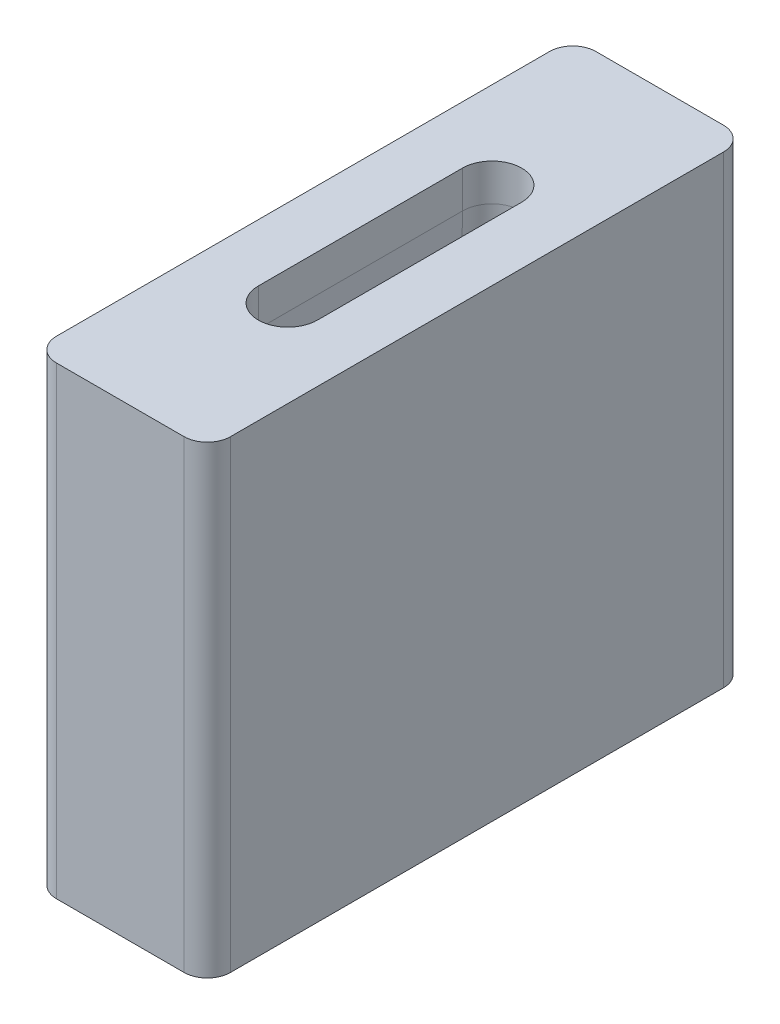
ISO-10303-21;
HEADER;
FILE_DESCRIPTION(('STEP AP214'),'2;1');
FILE_NAME('part.step','',(''),(''),'','','');
FILE_SCHEMA(('AUTOMOTIVE_DESIGN { 1 0 10303 214 1 1 1 1 }'));
ENDSEC;
DATA;
#1=APPLICATION_CONTEXT('core data for automotive mechanical design processes');
#2=APPLICATION_PROTOCOL_DEFINITION('international standard','automotive_design',2000,#1);
#3=PRODUCT_CONTEXT('',#1,'mechanical');
#4=PRODUCT('Part','Part','',(#3));
#5=PRODUCT_RELATED_PRODUCT_CATEGORY('part','',(#4));
#6=PRODUCT_DEFINITION_FORMATION('','',#4);
#7=PRODUCT_DEFINITION_CONTEXT('part definition',#1,'design');
#8=PRODUCT_DEFINITION('design','',#6,#7);
#9=PRODUCT_DEFINITION_SHAPE('','',#8);
#10=(LENGTH_UNIT() NAMED_UNIT(*) SI_UNIT(.MILLI.,.METRE.));
#11=(NAMED_UNIT(*) PLANE_ANGLE_UNIT() SI_UNIT($,.RADIAN.));
#12=(NAMED_UNIT(*) SI_UNIT($,.STERADIAN.) SOLID_ANGLE_UNIT());
#13=UNCERTAINTY_MEASURE_WITH_UNIT(LENGTH_MEASURE(1.E-05),#10,'distance_accuracy_value','');
#14=(GEOMETRIC_REPRESENTATION_CONTEXT(3) GLOBAL_UNCERTAINTY_ASSIGNED_CONTEXT((#13)) GLOBAL_UNIT_ASSIGNED_CONTEXT((#10,
#11,#12)) REPRESENTATION_CONTEXT('',''));
#15=CARTESIAN_POINT('',(0.,0.,0.));
#16=DIRECTION('',(0.,0.,1.));
#17=DIRECTION('',(1.,0.,0.));
#18=AXIS2_PLACEMENT_3D('',#15,#16,#17);
#19=CARTESIAN_POINT('',(0.,-40.001,8.8));
#20=DIRECTION('',(0.,1.,0.));
#21=DIRECTION('',(0.,0.,1.));
#22=AXIS2_PLACEMENT_3D('',#19,#20,#21);
#23=CYLINDRICAL_SURFACE('',#22,2.55);
#24=CARTESIAN_POINT('',(0.,-3.2,8.8));
#25=DIRECTION('',(0.,1.,0.));
#26=DIRECTION('',(-1.,0.,0.));
#27=AXIS2_PLACEMENT_3D('',#24,#25,#26);
#28=CIRCLE('',#27,2.55);
#29=CARTESIAN_POINT('',(-2.55,-3.2,8.8));
#30=VERTEX_POINT('',#29);
#31=CARTESIAN_POINT('',(2.55,-3.20000000000065,8.8));
#32=VERTEX_POINT('',#31);
#33=EDGE_CURVE('E75',#30,#32,#28,.T.);
#34=ORIENTED_EDGE('',*,*,#33,.F.);
#35=DIRECTION('',(0.,1.,0.));
#36=VECTOR('',#35,1.);
#37=CARTESIAN_POINT('',(-2.55,-40.001,8.8));
#38=LINE('',#37,#36);
#39=CARTESIAN_POINT('',(-2.55,0.,8.8));
#40=VERTEX_POINT('',#39);
#41=EDGE_CURVE('E238',#30,#40,#38,.T.);
#42=ORIENTED_EDGE('',*,*,#41,.T.);
#43=CARTESIAN_POINT('',(0.,0.,8.8));
#44=DIRECTION('',(0.,1.,0.));
#45=DIRECTION('',(0.,0.,1.));
#46=AXIS2_PLACEMENT_3D('',#43,#44,#45);
#47=CIRCLE('',#46,2.55);
#48=CARTESIAN_POINT('',(2.55,0.,8.8));
#49=VERTEX_POINT('',#48);
#50=EDGE_CURVE('E224',#40,#49,#47,.T.);
#51=ORIENTED_EDGE('',*,*,#50,.T.);
#52=DIRECTION('',(0.,1.,0.));
#53=VECTOR('',#52,1.);
#54=CARTESIAN_POINT('',(2.55,-40.001,8.8));
#55=LINE('',#54,#53);
#56=EDGE_CURVE('E237',#32,#49,#55,.T.);
#57=ORIENTED_EDGE('',*,*,#56,.F.);
#58=EDGE_LOOP('',(#34,#42,#51,#57));
#59=FACE_BOUND('',#58,.T.);
#60=ADVANCED_FACE('F51',(#59),#23,.F.);
#61=CARTESIAN_POINT('',(-2.55,-40.001,8.8));
#62=DIRECTION('',(-1.,0.,0.));
#63=DIRECTION('',(0.,0.,1.));
#64=AXIS2_PLACEMENT_3D('',#61,#62,#63);
#65=PLANE('',#64);
#66=DIRECTION('',(0.,0.,1.));
#67=VECTOR('',#66,1.);
#68=CARTESIAN_POINT('',(-2.55000000000001,-3.2,-8.8));
#69=LINE('',#68,#67);
#70=CARTESIAN_POINT('',(-2.55000000000001,-3.2,-8.8));
#71=VERTEX_POINT('',#70);
#72=EDGE_CURVE('E212',#71,#30,#69,.T.);
#73=ORIENTED_EDGE('',*,*,#72,.F.);
#74=DIRECTION('',(0.,1.,0.));
#75=VECTOR('',#74,1.);
#76=CARTESIAN_POINT('',(-2.55,-40.001,-8.8));
#77=LINE('',#76,#75);
#78=CARTESIAN_POINT('',(-2.55,0.,-8.8));
#79=VERTEX_POINT('',#78);
#80=EDGE_CURVE('E241',#71,#79,#77,.T.);
#81=ORIENTED_EDGE('',*,*,#80,.T.);
#82=DIRECTION('',(0.,0.,1.));
#83=VECTOR('',#82,1.);
#84=CARTESIAN_POINT('',(-2.55,0.,8.8));
#85=LINE('',#84,#83);
#86=EDGE_CURVE('E234',#79,#40,#85,.T.);
#87=ORIENTED_EDGE('',*,*,#86,.T.);
#88=ORIENTED_EDGE('',*,*,#41,.F.);
#89=EDGE_LOOP('',(#73,#81,#87,#88));
#90=FACE_BOUND('',#89,.T.);
#91=ADVANCED_FACE('F346',(#90),#65,.F.);
#92=CARTESIAN_POINT('',(0.,-40.001,-8.8));
#93=DIRECTION('',(0.,1.,0.));
#94=DIRECTION('',(0.,0.,1.));
#95=AXIS2_PLACEMENT_3D('',#92,#93,#94);
#96=CYLINDRICAL_SURFACE('',#95,2.55);
#97=CARTESIAN_POINT('',(0.,-3.2,-8.8));
#98=DIRECTION('',(0.,1.,0.));
#99=DIRECTION('',(1.,0.,0.));
#100=AXIS2_PLACEMENT_3D('',#97,#98,#99);
#101=CIRCLE('',#100,2.55);
#102=CARTESIAN_POINT('',(2.55,-3.2,-8.8));
#103=VERTEX_POINT('',#102);
#104=EDGE_CURVE('E204',#103,#71,#101,.T.);
#105=ORIENTED_EDGE('',*,*,#104,.F.);
#106=DIRECTION('',(0.,1.,0.));
#107=VECTOR('',#106,1.);
#108=CARTESIAN_POINT('',(2.55,-40.001,-8.8));
#109=LINE('',#108,#107);
#110=CARTESIAN_POINT('',(2.55,0.,-8.8));
#111=VERTEX_POINT('',#110);
#112=EDGE_CURVE('E243',#103,#111,#109,.T.);
#113=ORIENTED_EDGE('',*,*,#112,.T.);
#114=CARTESIAN_POINT('',(0.,0.,-8.8));
#115=DIRECTION('',(0.,1.,0.));
#116=DIRECTION('',(0.,0.,1.));
#117=AXIS2_PLACEMENT_3D('',#114,#115,#116);
#118=CIRCLE('',#117,2.55);
#119=EDGE_CURVE('E231',#111,#79,#118,.T.);
#120=ORIENTED_EDGE('',*,*,#119,.T.);
#121=ORIENTED_EDGE('',*,*,#80,.F.);
#122=EDGE_LOOP('',(#105,#113,#120,#121));
#123=FACE_BOUND('',#122,.T.);
#124=ADVANCED_FACE('F353',(#123),#96,.F.);
#125=CARTESIAN_POINT('',(2.55,-40.001,8.8));
#126=DIRECTION('',(1.,0.,0.));
#127=DIRECTION('',(0.,0.,-1.));
#128=AXIS2_PLACEMENT_3D('',#125,#126,#127);
#129=PLANE('',#128);
#130=DIRECTION('',(0.,0.,-1.));
#131=VECTOR('',#130,1.);
#132=CARTESIAN_POINT('',(2.55,-3.2,0.));
#133=LINE('',#132,#131);
#134=CARTESIAN_POINT('',(2.55,-3.2,0.));
#135=VERTEX_POINT('',#134);
#136=EDGE_CURVE('E196',#135,#103,#133,.T.);
#137=ORIENTED_EDGE('',*,*,#136,.F.);
#138=DIRECTION('',(0.,0.,-1.));
#139=VECTOR('',#138,1.);
#140=CARTESIAN_POINT('',(2.55,-3.2,8.8));
#141=LINE('',#140,#139);
#142=EDGE_CURVE('E221',#32,#135,#141,.T.);
#143=ORIENTED_EDGE('',*,*,#142,.F.);
#144=ORIENTED_EDGE('',*,*,#56,.T.);
#145=DIRECTION('',(0.,0.,-1.));
#146=VECTOR('',#145,1.);
#147=CARTESIAN_POINT('',(2.55,0.,8.8));
#148=LINE('',#147,#146);
#149=EDGE_CURVE('E228',#49,#111,#148,.T.);
#150=ORIENTED_EDGE('',*,*,#149,.T.);
#151=ORIENTED_EDGE('',*,*,#112,.F.);
#152=EDGE_LOOP('',(#137,#143,#144,#150,#151));
#153=FACE_BOUND('',#152,.T.);
#154=ADVANCED_FACE('F358',(#153),#129,.F.);
#155=CARTESIAN_POINT('',(-5.5,-40.,21.25));
#156=DIRECTION('',(0.,1.,0.));
#157=DIRECTION('',(0.,0.,1.));
#158=AXIS2_PLACEMENT_3D('',#155,#156,#157);
#159=CYLINDRICAL_SURFACE('',#158,2.);
#160=CARTESIAN_POINT('',(-5.5,0.,21.25));
#161=DIRECTION('',(0.,1.,0.));
#162=DIRECTION('',(0.,0.,-1.));
#163=AXIS2_PLACEMENT_3D('',#160,#161,#162);
#164=CIRCLE('',#163,2.);
#165=CARTESIAN_POINT('',(-7.5,0.,21.25));
#166=VERTEX_POINT('',#165);
#167=CARTESIAN_POINT('',(-5.5,0.,23.25));
#168=VERTEX_POINT('',#167);
#169=EDGE_CURVE('E240',#166,#168,#164,.T.);
#170=ORIENTED_EDGE('',*,*,#169,.F.);
#171=DIRECTION('',(0.,1.,0.));
#172=VECTOR('',#171,1.);
#173=CARTESIAN_POINT('',(-7.5,-40.,21.25));
#174=LINE('',#173,#172);
#175=CARTESIAN_POINT('',(-7.5,-40.,21.25));
#176=VERTEX_POINT('',#175);
#177=EDGE_CURVE('E11',#176,#166,#174,.T.);
#178=ORIENTED_EDGE('',*,*,#177,.F.);
#179=CARTESIAN_POINT('',(-5.5,-40.,21.25));
#180=DIRECTION('',(0.,1.,0.));
#181=DIRECTION('',(0.,0.,-1.));
#182=AXIS2_PLACEMENT_3D('',#179,#180,#181);
#183=CIRCLE('',#182,2.);
#184=CARTESIAN_POINT('',(-5.5,-40.,23.25));
#185=VERTEX_POINT('',#184);
#186=EDGE_CURVE('E246',#176,#185,#183,.T.);
#187=ORIENTED_EDGE('',*,*,#186,.T.);
#188=DIRECTION('',(0.,1.,0.));
#189=VECTOR('',#188,1.);
#190=CARTESIAN_POINT('',(-5.5,-40.,23.25));
#191=LINE('',#190,#189);
#192=EDGE_CURVE('E55',#185,#168,#191,.T.);
#193=ORIENTED_EDGE('',*,*,#192,.T.);
#194=EDGE_LOOP('',(#170,#178,#187,#193));
#195=FACE_BOUND('',#194,.T.);
#196=ADVANCED_FACE('F53',(#195),#159,.T.);
#197=CARTESIAN_POINT('',(-7.5,-40.,21.25));
#198=DIRECTION('',(-1.,0.,0.));
#199=DIRECTION('',(0.,0.,1.));
#200=AXIS2_PLACEMENT_3D('',#197,#198,#199);
#201=PLANE('',#200);
#202=DIRECTION('',(0.,0.,1.));
#203=VECTOR('',#202,1.);
#204=CARTESIAN_POINT('',(-7.5,0.,21.25));
#205=LINE('',#204,#203);
#206=CARTESIAN_POINT('',(-7.5,0.,-21.25));
#207=VERTEX_POINT('',#206);
#208=EDGE_CURVE('E250',#207,#166,#205,.T.);
#209=ORIENTED_EDGE('',*,*,#208,.F.);
#210=DIRECTION('',(0.,1.,0.));
#211=VECTOR('',#210,1.);
#212=CARTESIAN_POINT('',(-7.5,-40.,-21.25));
#213=LINE('',#212,#211);
#214=CARTESIAN_POINT('',(-7.5,-40.,-21.25));
#215=VERTEX_POINT('',#214);
#216=EDGE_CURVE('E60',#215,#207,#213,.T.);
#217=ORIENTED_EDGE('',*,*,#216,.F.);
#218=DIRECTION('',(0.,0.,1.));
#219=VECTOR('',#218,1.);
#220=CARTESIAN_POINT('',(-7.5,-40.,21.25));
#221=LINE('',#220,#219);
#222=EDGE_CURVE('E268',#215,#176,#221,.T.);
#223=ORIENTED_EDGE('',*,*,#222,.T.);
#224=ORIENTED_EDGE('',*,*,#177,.T.);
#225=EDGE_LOOP('',(#209,#217,#223,#224));
#226=FACE_BOUND('',#225,.T.);
#227=ADVANCED_FACE('F315',(#226),#201,.T.);
#228=CARTESIAN_POINT('',(-5.5,-40.,-21.25));
#229=DIRECTION('',(0.,1.,0.));
#230=DIRECTION('',(0.,0.,1.));
#231=AXIS2_PLACEMENT_3D('',#228,#229,#230);
#232=CYLINDRICAL_SURFACE('',#231,2.);
#233=CARTESIAN_POINT('',(-5.5,0.,-21.25));
#234=DIRECTION('',(0.,1.,0.));
#235=DIRECTION('',(0.,0.,-1.));
#236=AXIS2_PLACEMENT_3D('',#233,#234,#235);
#237=CIRCLE('',#236,2.);
#238=CARTESIAN_POINT('',(-5.5,0.,-23.25));
#239=VERTEX_POINT('',#238);
#240=EDGE_CURVE('E288',#239,#207,#237,.T.);
#241=ORIENTED_EDGE('',*,*,#240,.F.);
#242=DIRECTION('',(0.,1.,0.));
#243=VECTOR('',#242,1.);
#244=CARTESIAN_POINT('',(-5.5,-40.,-23.25));
#245=LINE('',#244,#243);
#246=CARTESIAN_POINT('',(-5.5,-40.,-23.25));
#247=VERTEX_POINT('',#246);
#248=EDGE_CURVE('E294',#247,#239,#245,.T.);
#249=ORIENTED_EDGE('',*,*,#248,.F.);
#250=CARTESIAN_POINT('',(-5.5,-40.,-21.25));
#251=DIRECTION('',(0.,1.,0.));
#252=DIRECTION('',(0.,0.,-1.));
#253=AXIS2_PLACEMENT_3D('',#250,#251,#252);
#254=CIRCLE('',#253,2.);
#255=EDGE_CURVE('E265',#247,#215,#254,.T.);
#256=ORIENTED_EDGE('',*,*,#255,.T.);
#257=ORIENTED_EDGE('',*,*,#216,.T.);
#258=EDGE_LOOP('',(#241,#249,#256,#257));
#259=FACE_BOUND('',#258,.T.);
#260=ADVANCED_FACE('F336',(#259),#232,.T.);
#261=CARTESIAN_POINT('',(-5.5,-40.,-23.25));
#262=DIRECTION('',(0.,0.,-1.));
#263=DIRECTION('',(-1.,0.,0.));
#264=AXIS2_PLACEMENT_3D('',#261,#262,#263);
#265=PLANE('',#264);
#266=DIRECTION('',(-1.,0.,0.));
#267=VECTOR('',#266,1.);
#268=CARTESIAN_POINT('',(-5.5,0.,-23.25));
#269=LINE('',#268,#267);
#270=CARTESIAN_POINT('',(5.5,0.,-23.25));
#271=VERTEX_POINT('',#270);
#272=EDGE_CURVE('E285',#271,#239,#269,.T.);
#273=ORIENTED_EDGE('',*,*,#272,.F.);
#274=DIRECTION('',(0.,1.,0.));
#275=VECTOR('',#274,1.);
#276=CARTESIAN_POINT('',(5.5,-40.,-23.25));
#277=LINE('',#276,#275);
#278=CARTESIAN_POINT('',(5.5,-40.,-23.25));
#279=VERTEX_POINT('',#278);
#280=EDGE_CURVE('E296',#279,#271,#277,.T.);
#281=ORIENTED_EDGE('',*,*,#280,.F.);
#282=DIRECTION('',(-1.,0.,0.));
#283=VECTOR('',#282,1.);
#284=CARTESIAN_POINT('',(-5.5,-40.,-23.25));
#285=LINE('',#284,#283);
#286=EDGE_CURVE('E262',#279,#247,#285,.T.);
#287=ORIENTED_EDGE('',*,*,#286,.T.);
#288=ORIENTED_EDGE('',*,*,#248,.T.);
#289=EDGE_LOOP('',(#273,#281,#287,#288));
#290=FACE_BOUND('',#289,.T.);
#291=ADVANCED_FACE('F334',(#290),#265,.T.);
#292=CARTESIAN_POINT('',(5.5,-40.,-21.25));
#293=DIRECTION('',(0.,1.,0.));
#294=DIRECTION('',(0.,0.,1.));
#295=AXIS2_PLACEMENT_3D('',#292,#293,#294);
#296=CYLINDRICAL_SURFACE('',#295,2.);
#297=CARTESIAN_POINT('',(5.5,0.,-21.25));
#298=DIRECTION('',(0.,1.,0.));
#299=DIRECTION('',(0.,0.,-1.));
#300=AXIS2_PLACEMENT_3D('',#297,#298,#299);
#301=CIRCLE('',#300,2.);
#302=CARTESIAN_POINT('',(7.5,0.,-21.25));
#303=VERTEX_POINT('',#302);
#304=EDGE_CURVE('E282',#303,#271,#301,.T.);
#305=ORIENTED_EDGE('',*,*,#304,.F.);
#306=DIRECTION('',(0.,1.,0.));
#307=VECTOR('',#306,1.);
#308=CARTESIAN_POINT('',(7.5,-40.,-21.25));
#309=LINE('',#308,#307);
#310=CARTESIAN_POINT('',(7.5,-40.,-21.25));
#311=VERTEX_POINT('',#310);
#312=EDGE_CURVE('E298',#311,#303,#309,.T.);
#313=ORIENTED_EDGE('',*,*,#312,.F.);
#314=CARTESIAN_POINT('',(5.5,-40.,-21.25));
#315=DIRECTION('',(0.,1.,0.));
#316=DIRECTION('',(0.,0.,-1.));
#317=AXIS2_PLACEMENT_3D('',#314,#315,#316);
#318=CIRCLE('',#317,2.);
#319=EDGE_CURVE('E259',#311,#279,#318,.T.);
#320=ORIENTED_EDGE('',*,*,#319,.T.);
#321=ORIENTED_EDGE('',*,*,#280,.T.);
#322=EDGE_LOOP('',(#305,#313,#320,#321));
#323=FACE_BOUND('',#322,.T.);
#324=ADVANCED_FACE('F330',(#323),#296,.T.);
#325=CARTESIAN_POINT('',(7.5,-40.,21.25));
#326=DIRECTION('',(1.,0.,0.));
#327=DIRECTION('',(0.,0.,-1.));
#328=AXIS2_PLACEMENT_3D('',#325,#326,#327);
#329=PLANE('',#328);
#330=DIRECTION('',(0.,0.,-1.));
#331=VECTOR('',#330,1.);
#332=CARTESIAN_POINT('',(7.5,0.,21.25));
#333=LINE('',#332,#331);
#334=CARTESIAN_POINT('',(7.5,0.,21.25));
#335=VERTEX_POINT('',#334);
#336=EDGE_CURVE('E279',#335,#303,#333,.T.);
#337=ORIENTED_EDGE('',*,*,#336,.F.);
#338=DIRECTION('',(0.,1.,0.));
#339=VECTOR('',#338,1.);
#340=CARTESIAN_POINT('',(7.5,-40.,21.25));
#341=LINE('',#340,#339);
#342=CARTESIAN_POINT('',(7.5,-40.,21.25));
#343=VERTEX_POINT('',#342);
#344=EDGE_CURVE('E300',#343,#335,#341,.T.);
#345=ORIENTED_EDGE('',*,*,#344,.F.);
#346=DIRECTION('',(0.,0.,-1.));
#347=VECTOR('',#346,1.);
#348=CARTESIAN_POINT('',(7.5,-40.,21.25));
#349=LINE('',#348,#347);
#350=EDGE_CURVE('E256',#343,#311,#349,.T.);
#351=ORIENTED_EDGE('',*,*,#350,.T.);
#352=ORIENTED_EDGE('',*,*,#312,.T.);
#353=EDGE_LOOP('',(#337,#345,#351,#352));
#354=FACE_BOUND('',#353,.T.);
#355=ADVANCED_FACE('F328',(#354),#329,.T.);
#356=CARTESIAN_POINT('',(5.5,-40.,21.25));
#357=DIRECTION('',(0.,1.,0.));
#358=DIRECTION('',(0.,0.,1.));
#359=AXIS2_PLACEMENT_3D('',#356,#357,#358);
#360=CYLINDRICAL_SURFACE('',#359,2.);
#361=CARTESIAN_POINT('',(5.5,0.,21.25));
#362=DIRECTION('',(0.,1.,0.));
#363=DIRECTION('',(0.,0.,1.));
#364=AXIS2_PLACEMENT_3D('',#361,#362,#363);
#365=CIRCLE('',#364,2.);
#366=CARTESIAN_POINT('',(5.5,0.,23.25));
#367=VERTEX_POINT('',#366);
#368=EDGE_CURVE('E276',#367,#335,#365,.T.);
#369=ORIENTED_EDGE('',*,*,#368,.F.);
#370=DIRECTION('',(0.,1.,0.));
#371=VECTOR('',#370,1.);
#372=CARTESIAN_POINT('',(5.5,-40.,23.25));
#373=LINE('',#372,#371);
#374=CARTESIAN_POINT('',(5.5,-40.,23.25));
#375=VERTEX_POINT('',#374);
#376=EDGE_CURVE('E301',#375,#367,#373,.T.);
#377=ORIENTED_EDGE('',*,*,#376,.F.);
#378=CARTESIAN_POINT('',(5.5,-40.,21.25));
#379=DIRECTION('',(0.,1.,0.));
#380=DIRECTION('',(0.,0.,1.));
#381=AXIS2_PLACEMENT_3D('',#378,#379,#380);
#382=CIRCLE('',#381,2.);
#383=EDGE_CURVE('E253',#375,#343,#382,.T.);
#384=ORIENTED_EDGE('',*,*,#383,.T.);
#385=ORIENTED_EDGE('',*,*,#344,.T.);
#386=EDGE_LOOP('',(#369,#377,#384,#385));
#387=FACE_BOUND('',#386,.T.);
#388=ADVANCED_FACE('F324',(#387),#360,.T.);
#389=CARTESIAN_POINT('',(-5.5,-40.,23.25));
#390=DIRECTION('',(0.,0.,1.));
#391=DIRECTION('',(1.,0.,0.));
#392=AXIS2_PLACEMENT_3D('',#389,#390,#391);
#393=PLANE('',#392);
#394=DIRECTION('',(1.,0.,0.));
#395=VECTOR('',#394,1.);
#396=CARTESIAN_POINT('',(-5.5,0.,23.25));
#397=LINE('',#396,#395);
#398=EDGE_CURVE('E273',#168,#367,#397,.T.);
#399=ORIENTED_EDGE('',*,*,#398,.F.);
#400=ORIENTED_EDGE('',*,*,#192,.F.);
#401=DIRECTION('',(1.,0.,0.));
#402=VECTOR('',#401,1.);
#403=CARTESIAN_POINT('',(-5.5,-40.,23.25));
#404=LINE('',#403,#402);
#405=EDGE_CURVE('E249',#185,#375,#404,.T.);
#406=ORIENTED_EDGE('',*,*,#405,.T.);
#407=ORIENTED_EDGE('',*,*,#376,.T.);
#408=EDGE_LOOP('',(#399,#400,#406,#407));
#409=FACE_BOUND('',#408,.T.);
#410=ADVANCED_FACE('F309',(#409),#393,.T.);
#411=CARTESIAN_POINT('',(-5.5,-40.,21.25));
#412=DIRECTION('',(0.,-1.,0.));
#413=DIRECTION('',(0.,0.,-1.));
#414=AXIS2_PLACEMENT_3D('',#411,#412,#413);
#415=PLANE('',#414);
#416=CARTESIAN_POINT('',(0.,-40.,-19.25));
#417=DIRECTION('',(0.,-1.,0.));
#418=DIRECTION('',(0.,0.,-1.));
#419=AXIS2_PLACEMENT_3D('',#416,#417,#418);
#420=CIRCLE('',#419,3.025);
#421=CARTESIAN_POINT('',(0.,-40.,-22.275));
#422=VERTEX_POINT('',#421);
#423=EDGE_CURVE('E181',#422,#422,#420,.T.);
#424=ORIENTED_EDGE('',*,*,#423,.F.);
#425=EDGE_LOOP('',(#424));
#426=FACE_BOUND('',#425,.T.);
#427=CARTESIAN_POINT('',(0.,-40.,19.25));
#428=DIRECTION('',(0.,-1.,0.));
#429=DIRECTION('',(0.,0.,-1.));
#430=AXIS2_PLACEMENT_3D('',#427,#428,#429);
#431=CIRCLE('',#430,3.025);
#432=CARTESIAN_POINT('',(0.,-40.,16.225));
#433=VERTEX_POINT('',#432);
#434=EDGE_CURVE('E174',#433,#433,#431,.T.);
#435=ORIENTED_EDGE('',*,*,#434,.F.);
#436=EDGE_LOOP('',(#435));
#437=FACE_BOUND('',#436,.T.);
#438=CARTESIAN_POINT('',(0.,-40.,8.8));
#439=DIRECTION('',(0.,1.,0.));
#440=DIRECTION('',(-1.,0.,0.));
#441=AXIS2_PLACEMENT_3D('',#438,#439,#440);
#442=CIRCLE('',#441,3.19234638935816);
#443=CARTESIAN_POINT('',(-3.19234638935816,-40.,8.8));
#444=VERTEX_POINT('',#443);
#445=CARTESIAN_POINT('',(3.19234638935816,-40.,8.8));
#446=VERTEX_POINT('',#445);
#447=EDGE_CURVE('E211',#444,#446,#442,.T.);
#448=ORIENTED_EDGE('',*,*,#447,.T.);
#449=DIRECTION('',(0.,0.,-1.));
#450=VECTOR('',#449,1.);
#451=CARTESIAN_POINT('',(3.19234638935816,-40.,8.8));
#452=LINE('',#451,#450);
#453=CARTESIAN_POINT('',(3.19234638935816,-40.,0.));
#454=VERTEX_POINT('',#453);
#455=EDGE_CURVE('E68',#446,#454,#452,.T.);
#456=ORIENTED_EDGE('',*,*,#455,.T.);
#457=DIRECTION('',(0.,0.,-1.));
#458=VECTOR('',#457,1.);
#459=CARTESIAN_POINT('',(3.19234638935816,-40.,0.));
#460=LINE('',#459,#458);
#461=CARTESIAN_POINT('',(3.19234638935816,-40.,-8.8));
#462=VERTEX_POINT('',#461);
#463=EDGE_CURVE('E192',#454,#462,#460,.T.);
#464=ORIENTED_EDGE('',*,*,#463,.T.);
#465=CARTESIAN_POINT('',(0.,-40.,-8.8));
#466=DIRECTION('',(0.,1.,0.));
#467=DIRECTION('',(1.,0.,0.));
#468=AXIS2_PLACEMENT_3D('',#465,#466,#467);
#469=CIRCLE('',#468,3.19234638935816);
#470=CARTESIAN_POINT('',(-3.19234638935816,-40.,-8.8));
#471=VERTEX_POINT('',#470);
#472=EDGE_CURVE('E198',#462,#471,#469,.T.);
#473=ORIENTED_EDGE('',*,*,#472,.T.);
#474=DIRECTION('',(0.,0.,1.));
#475=VECTOR('',#474,1.);
#476=CARTESIAN_POINT('',(-3.19234638935816,-40.,-8.8));
#477=LINE('',#476,#475);
#478=EDGE_CURVE('E206',#471,#444,#477,.T.);
#479=ORIENTED_EDGE('',*,*,#478,.T.);
#480=EDGE_LOOP('',(#448,#456,#464,#473,#479));
#481=FACE_BOUND('',#480,.T.);
#482=ORIENTED_EDGE('',*,*,#186,.F.);
#483=ORIENTED_EDGE('',*,*,#222,.F.);
#484=ORIENTED_EDGE('',*,*,#255,.F.);
#485=ORIENTED_EDGE('',*,*,#286,.F.);
#486=ORIENTED_EDGE('',*,*,#319,.F.);
#487=ORIENTED_EDGE('',*,*,#350,.F.);
#488=ORIENTED_EDGE('',*,*,#383,.F.);
#489=ORIENTED_EDGE('',*,*,#405,.F.);
#490=EDGE_LOOP('',(#482,#483,#484,#485,#486,#487,#488,#489));
#491=FACE_BOUND('',#490,.T.);
#492=ADVANCED_FACE('F318',(#426,#437,#481,#491),#415,.T.);
#493=CARTESIAN_POINT('',(-5.5,0.,21.25));
#494=DIRECTION('',(0.,-1.,0.));
#495=DIRECTION('',(0.,0.,-1.));
#496=AXIS2_PLACEMENT_3D('',#493,#494,#495);
#497=PLANE('',#496);
#498=ORIENTED_EDGE('',*,*,#149,.F.);
#499=ORIENTED_EDGE('',*,*,#50,.F.);
#500=ORIENTED_EDGE('',*,*,#86,.F.);
#501=ORIENTED_EDGE('',*,*,#119,.F.);
#502=EDGE_LOOP('',(#498,#499,#500,#501));
#503=FACE_BOUND('',#502,.T.);
#504=ORIENTED_EDGE('',*,*,#169,.T.);
#505=ORIENTED_EDGE('',*,*,#398,.T.);
#506=ORIENTED_EDGE('',*,*,#368,.T.);
#507=ORIENTED_EDGE('',*,*,#336,.T.);
#508=ORIENTED_EDGE('',*,*,#304,.T.);
#509=ORIENTED_EDGE('',*,*,#272,.T.);
#510=ORIENTED_EDGE('',*,*,#240,.T.);
#511=ORIENTED_EDGE('',*,*,#208,.T.);
#512=EDGE_LOOP('',(#504,#505,#506,#507,#508,#509,#510,#511));
#513=FACE_BOUND('',#512,.T.);
#514=ADVANCED_FACE('F311',(#503,#513),#497,.F.);
#515=CARTESIAN_POINT('',(2.55,-3.2,8.8));
#516=DIRECTION('',(-0.999847695156391,-0.0174524064372768,0.));
#517=DIRECTION('',(0.0174524064372768,-0.999847695156391,0.));
#518=AXIS2_PLACEMENT_3D('',#515,#516,#517);
#519=PLANE('',#518);
#520=DIRECTION('',(-0.0174524064372768,0.999847695156391,0.));
#521=VECTOR('',#520,1.);
#522=CARTESIAN_POINT('',(2.55,-3.2,8.8));
#523=LINE('',#522,#521);
#524=EDGE_CURVE('E216',#446,#32,#523,.T.);
#525=ORIENTED_EDGE('',*,*,#524,.T.);
#526=ORIENTED_EDGE('',*,*,#142,.T.);
#527=DIRECTION('',(-0.0174524064372768,0.999847695156391,0.));
#528=VECTOR('',#527,1.);
#529=CARTESIAN_POINT('',(2.55,-3.2,0.));
#530=LINE('',#529,#528);
#531=EDGE_CURVE('E190',#454,#135,#530,.T.);
#532=ORIENTED_EDGE('',*,*,#531,.F.);
#533=ORIENTED_EDGE('',*,*,#455,.F.);
#534=EDGE_LOOP('',(#525,#526,#532,#533));
#535=FACE_BOUND('',#534,.T.);
#536=ADVANCED_FACE('F363',(#535),#519,.T.);
#537=CARTESIAN_POINT('',(2.55,-3.2,0.));
#538=DIRECTION('',(-0.999847695156391,-0.0174524064372768,0.));
#539=DIRECTION('',(0.0174524064372768,-0.999847695156391,0.));
#540=AXIS2_PLACEMENT_3D('',#537,#538,#539);
#541=PLANE('',#540);
#542=ORIENTED_EDGE('',*,*,#136,.T.);
#543=DIRECTION('',(-0.0174524064372768,0.999847695156391,0.));
#544=VECTOR('',#543,1.);
#545=CARTESIAN_POINT('',(2.55,-3.2,-8.8));
#546=LINE('',#545,#544);
#547=EDGE_CURVE('E193',#462,#103,#546,.T.);
#548=ORIENTED_EDGE('',*,*,#547,.F.);
#549=ORIENTED_EDGE('',*,*,#463,.F.);
#550=ORIENTED_EDGE('',*,*,#531,.T.);
#551=EDGE_LOOP('',(#542,#548,#549,#550));
#552=FACE_BOUND('',#551,.T.);
#553=ADVANCED_FACE('F369',(#552),#541,.T.);
#554=CARTESIAN_POINT('',(0.,-40.,-8.8));
#555=DIRECTION('',(0.,-1.,0.));
#556=DIRECTION('',(0.,0.,-1.));
#557=AXIS2_PLACEMENT_3D('',#554,#555,#556);
#558=CONICAL_SURFACE('',#557,3.19234638935816,0.0174532925199366);
#559=ORIENTED_EDGE('',*,*,#104,.T.);
#560=DIRECTION('',(0.0174524064372768,0.999847695156391,0.));
#561=VECTOR('',#560,1.);
#562=CARTESIAN_POINT('',(-2.55000000000001,-3.2,-8.8));
#563=LINE('',#562,#561);
#564=EDGE_CURVE('E201',#471,#71,#563,.T.);
#565=ORIENTED_EDGE('',*,*,#564,.F.);
#566=ORIENTED_EDGE('',*,*,#472,.F.);
#567=ORIENTED_EDGE('',*,*,#547,.T.);
#568=EDGE_LOOP('',(#559,#565,#566,#567));
#569=FACE_BOUND('',#568,.T.);
#570=ADVANCED_FACE('F386',(#569),#558,.F.);
#571=CARTESIAN_POINT('',(-2.55000000000001,-3.2,-8.8));
#572=DIRECTION('',(0.999847695156391,-0.0174524064372768,0.));
#573=DIRECTION('',(0.0174524064372768,0.999847695156391,0.));
#574=AXIS2_PLACEMENT_3D('',#571,#572,#573);
#575=PLANE('',#574);
#576=ORIENTED_EDGE('',*,*,#72,.T.);
#577=DIRECTION('',(0.0174524064372768,0.999847695156391,0.));
#578=VECTOR('',#577,1.);
#579=CARTESIAN_POINT('',(-2.55,-3.2,8.8));
#580=LINE('',#579,#578);
#581=EDGE_CURVE('E209',#444,#30,#580,.T.);
#582=ORIENTED_EDGE('',*,*,#581,.F.);
#583=ORIENTED_EDGE('',*,*,#478,.F.);
#584=ORIENTED_EDGE('',*,*,#564,.T.);
#585=EDGE_LOOP('',(#576,#582,#583,#584));
#586=FACE_BOUND('',#585,.T.);
#587=ADVANCED_FACE('F390',(#586),#575,.T.);
#588=CARTESIAN_POINT('',(0.,-40.,8.8));
#589=DIRECTION('',(0.,-1.,0.));
#590=DIRECTION('',(0.,0.,-1.));
#591=AXIS2_PLACEMENT_3D('',#588,#589,#590);
#592=CONICAL_SURFACE('',#591,3.19234638935816,0.0174532925199366);
#593=ORIENTED_EDGE('',*,*,#33,.T.);
#594=ORIENTED_EDGE('',*,*,#524,.F.);
#595=ORIENTED_EDGE('',*,*,#447,.F.);
#596=ORIENTED_EDGE('',*,*,#581,.T.);
#597=EDGE_LOOP('',(#593,#594,#595,#596));
#598=FACE_BOUND('',#597,.T.);
#599=ADVANCED_FACE('F395',(#598),#592,.F.);
#600=CARTESIAN_POINT('',(0.,-23.,19.25));
#601=DIRECTION('',(0.,-1.,0.));
#602=DIRECTION('',(0.,0.,-1.));
#603=AXIS2_PLACEMENT_3D('',#600,#601,#602);
#604=CONICAL_SURFACE('',#603,2.5,1.02974425867665);
#605=CARTESIAN_POINT('',(0.,-21.4978484524311,19.25));
#606=VERTEX_POINT('',#605);
#607=VERTEX_LOOP('',#606);
#608=FACE_BOUND('',#607,.T.);
#609=CARTESIAN_POINT('',(0.,-23.,19.25));
#610=DIRECTION('',(0.,-1.,0.));
#611=DIRECTION('',(0.,0.,-1.));
#612=AXIS2_PLACEMENT_3D('',#609,#610,#611);
#613=CIRCLE('',#612,2.5);
#614=CARTESIAN_POINT('',(0.,-23.,16.75));
#615=VERTEX_POINT('',#614);
#616=EDGE_CURVE('E187',#615,#615,#613,.T.);
#617=ORIENTED_EDGE('',*,*,#616,.T.);
#618=EDGE_LOOP('',(#617));
#619=FACE_BOUND('',#618,.T.);
#620=ADVANCED_FACE('F397',(#608,#619),#604,.F.);
#621=CARTESIAN_POINT('',(0.,-40.,19.25));
#622=DIRECTION('',(0.,-1.,0.));
#623=DIRECTION('',(0.,0.,-1.));
#624=AXIS2_PLACEMENT_3D('',#621,#622,#623);
#625=CYLINDRICAL_SURFACE('',#624,2.5);
#626=ORIENTED_EDGE('',*,*,#616,.F.);
#627=EDGE_LOOP('',(#626));
#628=FACE_BOUND('',#627,.T.);
#629=CARTESIAN_POINT('',(0.,-39.475,19.25));
#630=DIRECTION('',(0.,-1.,0.));
#631=DIRECTION('',(0.,0.,-1.));
#632=AXIS2_PLACEMENT_3D('',#629,#630,#631);
#633=CIRCLE('',#632,2.5);
#634=CARTESIAN_POINT('',(0.,-39.475,16.75));
#635=VERTEX_POINT('',#634);
#636=EDGE_CURVE('E178',#635,#635,#633,.T.);
#637=ORIENTED_EDGE('',*,*,#636,.T.);
#638=EDGE_LOOP('',(#637));
#639=FACE_BOUND('',#638,.T.);
#640=ADVANCED_FACE('F403',(#628,#639),#625,.F.);
#641=CARTESIAN_POINT('',(0.,-40.,19.25));
#642=DIRECTION('',(0.,-1.,0.));
#643=DIRECTION('',(0.,0.,-1.));
#644=AXIS2_PLACEMENT_3D('',#641,#642,#643);
#645=CONICAL_SURFACE('',#644,3.025,0.785398163397452);
#646=ORIENTED_EDGE('',*,*,#636,.F.);
#647=EDGE_LOOP('',(#646));
#648=FACE_BOUND('',#647,.T.);
#649=ORIENTED_EDGE('',*,*,#434,.T.);
#650=EDGE_LOOP('',(#649));
#651=FACE_BOUND('',#650,.T.);
#652=ADVANCED_FACE('F168',(#648,#651),#645,.F.);
#653=CARTESIAN_POINT('',(0.,-23.,-19.25));
#654=DIRECTION('',(0.,-1.,0.));
#655=DIRECTION('',(0.,0.,-1.));
#656=AXIS2_PLACEMENT_3D('',#653,#654,#655);
#657=CONICAL_SURFACE('',#656,2.5,1.02974425867665);
#658=CARTESIAN_POINT('',(0.,-21.4978484524311,-19.25));
#659=VERTEX_POINT('',#658);
#660=VERTEX_LOOP('',#659);
#661=FACE_BOUND('',#660,.T.);
#662=CARTESIAN_POINT('',(0.,-23.,-19.25));
#663=DIRECTION('',(0.,-1.,0.));
#664=DIRECTION('',(0.,0.,-1.));
#665=AXIS2_PLACEMENT_3D('',#662,#663,#664);
#666=CIRCLE('',#665,2.5);
#667=CARTESIAN_POINT('',(0.,-23.,-21.75));
#668=VERTEX_POINT('',#667);
#669=EDGE_CURVE('E172',#668,#668,#666,.T.);
#670=ORIENTED_EDGE('',*,*,#669,.T.);
#671=EDGE_LOOP('',(#670));
#672=FACE_BOUND('',#671,.T.);
#673=ADVANCED_FACE('F164',(#661,#672),#657,.F.);
#674=CARTESIAN_POINT('',(0.,-40.,-19.25));
#675=DIRECTION('',(0.,-1.,0.));
#676=DIRECTION('',(0.,0.,-1.));
#677=AXIS2_PLACEMENT_3D('',#674,#675,#676);
#678=CYLINDRICAL_SURFACE('',#677,2.5);
#679=ORIENTED_EDGE('',*,*,#669,.F.);
#680=EDGE_LOOP('',(#679));
#681=FACE_BOUND('',#680,.T.);
#682=CARTESIAN_POINT('',(0.,-39.475,-19.25));
#683=DIRECTION('',(0.,-1.,0.));
#684=DIRECTION('',(0.,0.,-1.));
#685=AXIS2_PLACEMENT_3D('',#682,#683,#684);
#686=CIRCLE('',#685,2.5);
#687=CARTESIAN_POINT('',(0.,-39.475,-21.75));
#688=VERTEX_POINT('',#687);
#689=EDGE_CURVE('E175',#688,#688,#686,.T.);
#690=ORIENTED_EDGE('',*,*,#689,.T.);
#691=EDGE_LOOP('',(#690));
#692=FACE_BOUND('',#691,.T.);
#693=ADVANCED_FACE('F167',(#681,#692),#678,.F.);
#694=CARTESIAN_POINT('',(0.,-40.,-19.25));
#695=DIRECTION('',(0.,-1.,0.));
#696=DIRECTION('',(0.,0.,-1.));
#697=AXIS2_PLACEMENT_3D('',#694,#695,#696);
#698=CONICAL_SURFACE('',#697,3.025,0.785398163397452);
#699=ORIENTED_EDGE('',*,*,#689,.F.);
#700=EDGE_LOOP('',(#699));
#701=FACE_BOUND('',#700,.T.);
#702=ORIENTED_EDGE('',*,*,#423,.T.);
#703=EDGE_LOOP('',(#702));
#704=FACE_BOUND('',#703,.T.);
#705=ADVANCED_FACE('F566',(#701,#704),#698,.F.);
#706=CLOSED_SHELL('',(#60,#91,#124,#154,#196,#227,#260,#291,#324,#355,#388,#410,#492,#514,#536,
#553,#570,#587,#599,#620,#640,#652,#673,#693,#705));
#707=MANIFOLD_SOLID_BREP('B2',#706);
#708=ADVANCED_BREP_SHAPE_REPRESENTATION('',(#18,#707),#14);
#709=SHAPE_DEFINITION_REPRESENTATION(#9,#708);
ENDSEC;
END-ISO-10303-21;
